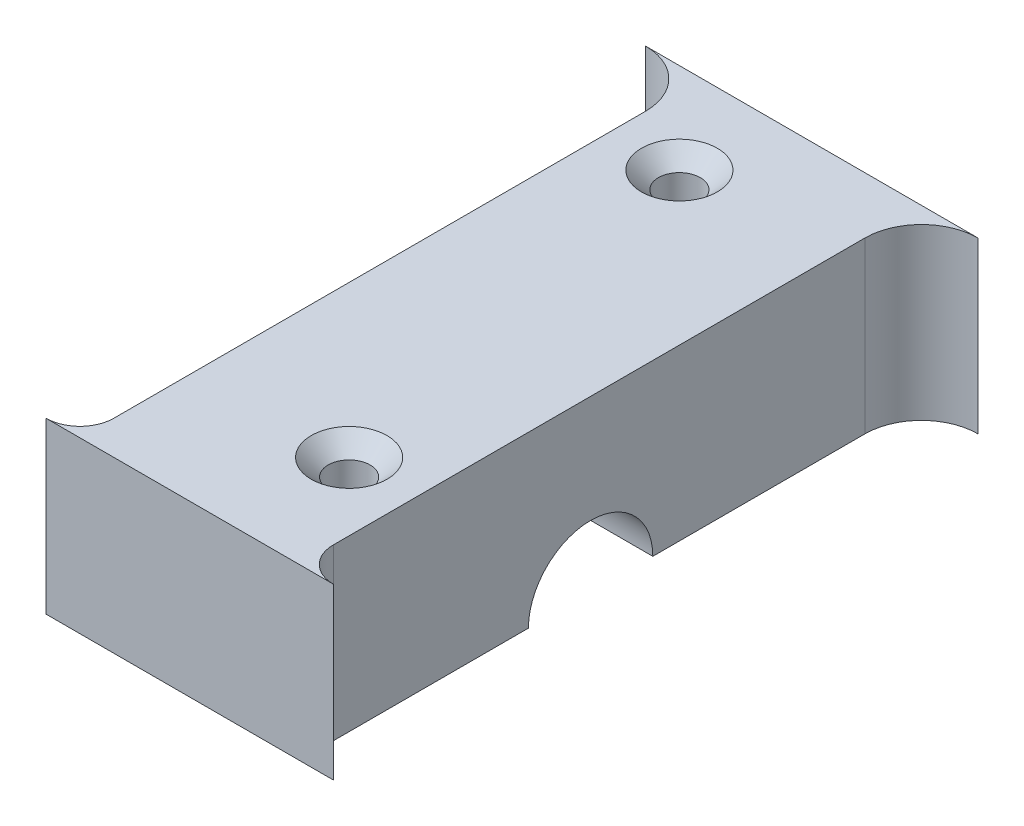
ISO-10303-21;
HEADER;
FILE_DESCRIPTION(('STEP AP214'),'2;1');
FILE_NAME('part.step','',(''),(''),'','','');
FILE_SCHEMA(('AUTOMOTIVE_DESIGN { 1 0 10303 214 1 1 1 1 }'));
ENDSEC;
DATA;
#1=APPLICATION_CONTEXT('core data for automotive mechanical design processes');
#2=APPLICATION_PROTOCOL_DEFINITION('international standard','automotive_design',2000,#1);
#3=PRODUCT_CONTEXT('',#1,'mechanical');
#4=PRODUCT('Part','Part','',(#3));
#5=PRODUCT_RELATED_PRODUCT_CATEGORY('part','',(#4));
#6=PRODUCT_DEFINITION_FORMATION('','',#4);
#7=PRODUCT_DEFINITION_CONTEXT('part definition',#1,'design');
#8=PRODUCT_DEFINITION('design','',#6,#7);
#9=PRODUCT_DEFINITION_SHAPE('','',#8);
#10=(LENGTH_UNIT() NAMED_UNIT(*) SI_UNIT(.MILLI.,.METRE.));
#11=(NAMED_UNIT(*) PLANE_ANGLE_UNIT() SI_UNIT($,.RADIAN.));
#12=(NAMED_UNIT(*) SI_UNIT($,.STERADIAN.) SOLID_ANGLE_UNIT());
#13=UNCERTAINTY_MEASURE_WITH_UNIT(LENGTH_MEASURE(1.E-05),#10,'distance_accuracy_value','');
#14=(GEOMETRIC_REPRESENTATION_CONTEXT(3) GLOBAL_UNCERTAINTY_ASSIGNED_CONTEXT((#13)) GLOBAL_UNIT_ASSIGNED_CONTEXT((#10,
#11,#12)) REPRESENTATION_CONTEXT('',''));
#15=CARTESIAN_POINT('',(0.,0.,0.));
#16=DIRECTION('',(0.,0.,1.));
#17=DIRECTION('',(1.,0.,0.));
#18=AXIS2_PLACEMENT_3D('',#15,#16,#17);
#19=CARTESIAN_POINT('',(-2.00000000000001,0.,-25.75));
#20=DIRECTION('',(1.,0.,0.));
#21=DIRECTION('',(0.,0.,-1.));
#22=AXIS2_PLACEMENT_3D('',#19,#20,#21);
#23=CYLINDRICAL_SURFACE('',#22,5.5);
#24=CARTESIAN_POINT('',(10.7,0.,-25.75));
#25=DIRECTION('',(1.,0.,0.));
#26=DIRECTION('',(0.,0.,-1.));
#27=AXIS2_PLACEMENT_3D('',#24,#25,#26);
#28=CIRCLE('',#27,5.5);
#29=CARTESIAN_POINT('',(10.7,0.,-20.25));
#30=VERTEX_POINT('',#29);
#31=CARTESIAN_POINT('',(10.7,0.,-31.25));
#32=VERTEX_POINT('',#31);
#33=EDGE_CURVE('E145',#30,#32,#28,.F.);
#34=ORIENTED_EDGE('',*,*,#33,.F.);
#35=DIRECTION('',(1.,0.,0.));
#36=VECTOR('',#35,1.);
#37=CARTESIAN_POINT('',(-2.00000000000001,0.,-20.25));
#38=LINE('',#37,#36);
#39=CARTESIAN_POINT('',(3.,0.,-20.25));
#40=VERTEX_POINT('',#39);
#41=EDGE_CURVE('E234',#40,#30,#38,.T.);
#42=ORIENTED_EDGE('',*,*,#41,.F.);
#43=CARTESIAN_POINT('',(3.,0.,-25.75));
#44=DIRECTION('',(1.,0.,0.));
#45=DIRECTION('',(0.,0.,-1.));
#46=AXIS2_PLACEMENT_3D('',#43,#44,#45);
#47=CIRCLE('',#46,5.5);
#48=CARTESIAN_POINT('',(3.,0.,-31.25));
#49=VERTEX_POINT('',#48);
#50=EDGE_CURVE('E256',#49,#40,#47,.T.);
#51=ORIENTED_EDGE('',*,*,#50,.F.);
#52=DIRECTION('',(1.,0.,0.));
#53=VECTOR('',#52,1.);
#54=CARTESIAN_POINT('',(-2.00000000000001,0.,-31.25));
#55=LINE('',#54,#53);
#56=EDGE_CURVE('E63',#32,#49,#55,.F.);
#57=ORIENTED_EDGE('',*,*,#56,.F.);
#58=EDGE_LOOP('',(#34,#42,#51,#57));
#59=FACE_BOUND('',#58,.T.);
#60=ADVANCED_FACE('F39',(#59),#23,.F.);
#61=CARTESIAN_POINT('',(0.,0.,-3.));
#62=DIRECTION('',(0.,1.,0.));
#63=DIRECTION('',(0.,0.,1.));
#64=AXIS2_PLACEMENT_3D('',#61,#62,#63);
#65=PLANE('',#64);
#66=CARTESIAN_POINT('',(16.4,0.,-10.4));
#67=DIRECTION('',(0.,-1.,0.));
#68=DIRECTION('',(0.,0.,-1.));
#69=AXIS2_PLACEMENT_3D('',#66,#67,#68);
#70=CIRCLE('',#69,1.85);
#71=CARTESIAN_POINT('',(16.4,0.,-12.25));
#72=VERTEX_POINT('',#71);
#73=EDGE_CURVE('E158',#72,#72,#70,.T.);
#74=ORIENTED_EDGE('',*,*,#73,.F.);
#75=EDGE_LOOP('',(#74));
#76=FACE_BOUND('',#75,.T.);
#77=DIRECTION('',(-1.,0.,0.));
#78=VECTOR('',#77,1.);
#79=CARTESIAN_POINT('',(14.7,0.,-14.25));
#80=LINE('',#79,#78);
#81=CARTESIAN_POINT('',(14.7,0.,-14.25));
#82=VERTEX_POINT('',#81);
#83=CARTESIAN_POINT('',(10.7,0.,-14.25));
#84=VERTEX_POINT('',#83);
#85=EDGE_CURVE('E156',#82,#84,#80,.T.);
#86=ORIENTED_EDGE('',*,*,#85,.F.);
#87=DIRECTION('',(0.,0.,-1.));
#88=VECTOR('',#87,1.);
#89=CARTESIAN_POINT('',(14.7,0.,-3.));
#90=LINE('',#89,#88);
#91=CARTESIAN_POINT('',(14.7,0.,-20.25));
#92=VERTEX_POINT('',#91);
#93=EDGE_CURVE('E248',#82,#92,#90,.T.);
#94=ORIENTED_EDGE('',*,*,#93,.T.);
#95=CARTESIAN_POINT('',(22.4,0.,-20.25));
#96=VERTEX_POINT('',#95);
#97=EDGE_CURVE('E233',#92,#96,#38,.T.);
#98=ORIENTED_EDGE('',*,*,#97,.T.);
#99=DIRECTION('',(0.,0.,-1.));
#100=VECTOR('',#99,1.);
#101=CARTESIAN_POINT('',(22.4,0.,-50.));
#102=LINE('',#101,#100);
#103=CARTESIAN_POINT('',(22.4,0.,-3.));
#104=VERTEX_POINT('',#103);
#105=EDGE_CURVE('E247',#104,#96,#102,.T.);
#106=ORIENTED_EDGE('',*,*,#105,.F.);
#107=CARTESIAN_POINT('',(25.4,0.,-3.));
#108=DIRECTION('',(0.,-1.,0.));
#109=DIRECTION('',(0.,0.,-1.));
#110=AXIS2_PLACEMENT_3D('',#107,#108,#109);
#111=CIRCLE('',#110,3.);
#112=CARTESIAN_POINT('',(25.4,0.,0.));
#113=VERTEX_POINT('',#112);
#114=EDGE_CURVE('E270',#113,#104,#111,.T.);
#115=ORIENTED_EDGE('',*,*,#114,.F.);
#116=DIRECTION('',(1.,0.,0.));
#117=VECTOR('',#116,1.);
#118=CARTESIAN_POINT('',(0.,0.,0.));
#119=LINE('',#118,#117);
#120=CARTESIAN_POINT('',(0.,0.,0.));
#121=VERTEX_POINT('',#120);
#122=EDGE_CURVE('E325',#121,#113,#119,.T.);
#123=ORIENTED_EDGE('',*,*,#122,.F.);
#124=CARTESIAN_POINT('',(0.,0.,-3.));
#125=DIRECTION('',(0.,-1.,0.));
#126=DIRECTION('',(0.,0.,1.));
#127=AXIS2_PLACEMENT_3D('',#124,#125,#126);
#128=CIRCLE('',#127,3.);
#129=CARTESIAN_POINT('',(3.,0.,-3.));
#130=VERTEX_POINT('',#129);
#131=EDGE_CURVE('E218',#130,#121,#128,.T.);
#132=ORIENTED_EDGE('',*,*,#131,.F.);
#133=DIRECTION('',(0.,0.,1.));
#134=VECTOR('',#133,1.);
#135=CARTESIAN_POINT('',(2.99999999999999,0.,-50.));
#136=LINE('',#135,#134);
#137=EDGE_CURVE('E279',#40,#130,#136,.T.);
#138=ORIENTED_EDGE('',*,*,#137,.F.);
#139=ORIENTED_EDGE('',*,*,#41,.T.);
#140=DIRECTION('',(0.,0.,-1.));
#141=VECTOR('',#140,1.);
#142=CARTESIAN_POINT('',(10.7,0.,-3.));
#143=LINE('',#142,#141);
#144=EDGE_CURVE('E55',#84,#30,#143,.T.);
#145=ORIENTED_EDGE('',*,*,#144,.F.);
#146=EDGE_LOOP('',(#86,#94,#98,#106,#115,#123,#132,#138,#139,#145));
#147=FACE_BOUND('',#146,.T.);
#148=ADVANCED_FACE('F244',(#76,#147),#65,.F.);
#149=CARTESIAN_POINT('',(0.,15.,-3.));
#150=DIRECTION('',(0.,-1.,0.));
#151=DIRECTION('',(0.,0.,-1.));
#152=AXIS2_PLACEMENT_3D('',#149,#150,#151);
#153=CYLINDRICAL_SURFACE('',#152,3.);
#154=ORIENTED_EDGE('',*,*,#131,.T.);
#155=DIRECTION('',(0.,-1.,0.));
#156=VECTOR('',#155,1.);
#157=CARTESIAN_POINT('',(0.,15.,0.));
#158=LINE('',#157,#156);
#159=CARTESIAN_POINT('',(0.,15.,0.));
#160=VERTEX_POINT('',#159);
#161=EDGE_CURVE('E215',#160,#121,#158,.T.);
#162=ORIENTED_EDGE('',*,*,#161,.F.);
#163=CARTESIAN_POINT('',(0.,15.,-3.));
#164=DIRECTION('',(0.,-1.,0.));
#165=DIRECTION('',(0.,0.,1.));
#166=AXIS2_PLACEMENT_3D('',#163,#164,#165);
#167=CIRCLE('',#166,3.);
#168=CARTESIAN_POINT('',(3.,15.,-3.));
#169=VERTEX_POINT('',#168);
#170=EDGE_CURVE('E201',#169,#160,#167,.T.);
#171=ORIENTED_EDGE('',*,*,#170,.F.);
#172=DIRECTION('',(0.,-1.,0.));
#173=VECTOR('',#172,1.);
#174=CARTESIAN_POINT('',(3.,15.,-3.));
#175=LINE('',#174,#173);
#176=EDGE_CURVE('E283',#169,#130,#175,.T.);
#177=ORIENTED_EDGE('',*,*,#176,.T.);
#178=EDGE_LOOP('',(#154,#162,#171,#177));
#179=FACE_BOUND('',#178,.T.);
#180=ADVANCED_FACE('F216',(#179),#153,.F.);
#181=CARTESIAN_POINT('',(0.,15.,0.));
#182=DIRECTION('',(0.,0.,-1.));
#183=DIRECTION('',(-1.,0.,0.));
#184=AXIS2_PLACEMENT_3D('',#181,#182,#183);
#185=PLANE('',#184);
#186=ORIENTED_EDGE('',*,*,#122,.T.);
#187=DIRECTION('',(0.,-1.,0.));
#188=VECTOR('',#187,1.);
#189=CARTESIAN_POINT('',(25.4,15.,0.));
#190=LINE('',#189,#188);
#191=CARTESIAN_POINT('',(25.4,15.,0.));
#192=VERTEX_POINT('',#191);
#193=EDGE_CURVE('E221',#192,#113,#190,.T.);
#194=ORIENTED_EDGE('',*,*,#193,.F.);
#195=DIRECTION('',(1.,0.,0.));
#196=VECTOR('',#195,1.);
#197=CARTESIAN_POINT('',(0.,15.,0.));
#198=LINE('',#197,#196);
#199=EDGE_CURVE('E203',#160,#192,#198,.T.);
#200=ORIENTED_EDGE('',*,*,#199,.F.);
#201=ORIENTED_EDGE('',*,*,#161,.T.);
#202=EDGE_LOOP('',(#186,#194,#200,#201));
#203=FACE_BOUND('',#202,.T.);
#204=ADVANCED_FACE('F357',(#203),#185,.F.);
#205=CARTESIAN_POINT('',(25.4,15.,-3.));
#206=DIRECTION('',(0.,-1.,0.));
#207=DIRECTION('',(0.,0.,-1.));
#208=AXIS2_PLACEMENT_3D('',#205,#206,#207);
#209=CYLINDRICAL_SURFACE('',#208,3.);
#210=ORIENTED_EDGE('',*,*,#114,.T.);
#211=DIRECTION('',(0.,-1.,0.));
#212=VECTOR('',#211,1.);
#213=CARTESIAN_POINT('',(22.4,15.,-3.));
#214=LINE('',#213,#212);
#215=CARTESIAN_POINT('',(22.4,15.,-3.));
#216=VERTEX_POINT('',#215);
#217=EDGE_CURVE('E228',#216,#104,#214,.T.);
#218=ORIENTED_EDGE('',*,*,#217,.F.);
#219=CARTESIAN_POINT('',(25.4,15.,-3.));
#220=DIRECTION('',(0.,-1.,0.));
#221=DIRECTION('',(0.,0.,-1.));
#222=AXIS2_PLACEMENT_3D('',#219,#220,#221);
#223=CIRCLE('',#222,3.);
#224=EDGE_CURVE('E316',#192,#216,#223,.T.);
#225=ORIENTED_EDGE('',*,*,#224,.F.);
#226=ORIENTED_EDGE('',*,*,#193,.T.);
#227=EDGE_LOOP('',(#210,#218,#225,#226));
#228=FACE_BOUND('',#227,.T.);
#229=ADVANCED_FACE('F475',(#228),#209,.F.);
#230=CARTESIAN_POINT('',(22.4,15.,-50.));
#231=DIRECTION('',(-1.,0.,0.));
#232=DIRECTION('',(0.,0.,1.));
#233=AXIS2_PLACEMENT_3D('',#230,#231,#232);
#234=PLANE('',#233);
#235=ORIENTED_EDGE('',*,*,#105,.T.);
#236=CARTESIAN_POINT('',(22.4,0.,-25.75));
#237=DIRECTION('',(-1.,0.,0.));
#238=DIRECTION('',(0.,0.,1.));
#239=AXIS2_PLACEMENT_3D('',#236,#237,#238);
#240=CIRCLE('',#239,5.5);
#241=CARTESIAN_POINT('',(22.4,0.,-31.25));
#242=VERTEX_POINT('',#241);
#243=EDGE_CURVE('E251',#96,#242,#240,.T.);
#244=ORIENTED_EDGE('',*,*,#243,.T.);
#245=CARTESIAN_POINT('',(22.4,0.,-50.));
#246=VERTEX_POINT('',#245);
#247=EDGE_CURVE('E264',#242,#246,#102,.T.);
#248=ORIENTED_EDGE('',*,*,#247,.T.);
#249=DIRECTION('',(0.,-1.,0.));
#250=VECTOR('',#249,1.);
#251=CARTESIAN_POINT('',(22.4,15.,-50.));
#252=LINE('',#251,#250);
#253=CARTESIAN_POINT('',(22.4,15.,-50.));
#254=VERTEX_POINT('',#253);
#255=EDGE_CURVE('E298',#254,#246,#252,.T.);
#256=ORIENTED_EDGE('',*,*,#255,.F.);
#257=DIRECTION('',(0.,0.,-1.));
#258=VECTOR('',#257,1.);
#259=CARTESIAN_POINT('',(22.4,15.,-50.));
#260=LINE('',#259,#258);
#261=EDGE_CURVE('E313',#216,#254,#260,.T.);
#262=ORIENTED_EDGE('',*,*,#261,.F.);
#263=ORIENTED_EDGE('',*,*,#217,.T.);
#264=EDGE_LOOP('',(#235,#244,#248,#256,#262,#263));
#265=FACE_BOUND('',#264,.T.);
#266=ADVANCED_FACE('F259',(#265),#234,.F.);
#267=CARTESIAN_POINT('',(27.4,15.,-50.));
#268=DIRECTION('',(0.,-1.,0.));
#269=DIRECTION('',(0.,0.,-1.));
#270=AXIS2_PLACEMENT_3D('',#267,#268,#269);
#271=CYLINDRICAL_SURFACE('',#270,5.);
#272=CARTESIAN_POINT('',(27.4,0.,-50.));
#273=DIRECTION('',(0.,-1.,0.));
#274=DIRECTION('',(0.,0.,1.));
#275=AXIS2_PLACEMENT_3D('',#272,#273,#274);
#276=CIRCLE('',#275,5.);
#277=CARTESIAN_POINT('',(27.4,0.,-55.));
#278=VERTEX_POINT('',#277);
#279=EDGE_CURVE('E263',#246,#278,#276,.T.);
#280=ORIENTED_EDGE('',*,*,#279,.T.);
#281=DIRECTION('',(0.,-1.,0.));
#282=VECTOR('',#281,1.);
#283=CARTESIAN_POINT('',(27.4,15.,-55.));
#284=LINE('',#283,#282);
#285=CARTESIAN_POINT('',(27.4,15.,-55.));
#286=VERTEX_POINT('',#285);
#287=EDGE_CURVE('E294',#286,#278,#284,.T.);
#288=ORIENTED_EDGE('',*,*,#287,.F.);
#289=CARTESIAN_POINT('',(27.4,15.,-50.));
#290=DIRECTION('',(0.,-1.,0.));
#291=DIRECTION('',(0.,0.,1.));
#292=AXIS2_PLACEMENT_3D('',#289,#290,#291);
#293=CIRCLE('',#292,5.);
#294=EDGE_CURVE('E310',#254,#286,#293,.T.);
#295=ORIENTED_EDGE('',*,*,#294,.F.);
#296=ORIENTED_EDGE('',*,*,#255,.T.);
#297=EDGE_LOOP('',(#280,#288,#295,#296));
#298=FACE_BOUND('',#297,.T.);
#299=ADVANCED_FACE('F460',(#298),#271,.F.);
#300=CARTESIAN_POINT('',(27.4,15.,-55.));
#301=DIRECTION('',(0.,0.,1.));
#302=DIRECTION('',(1.,0.,0.));
#303=AXIS2_PLACEMENT_3D('',#300,#301,#302);
#304=PLANE('',#303);
#305=DIRECTION('',(-1.,0.,0.));
#306=VECTOR('',#305,1.);
#307=CARTESIAN_POINT('',(27.4,0.,-55.));
#308=LINE('',#307,#306);
#309=CARTESIAN_POINT('',(-2.00000000000001,0.,-55.));
#310=VERTEX_POINT('',#309);
#311=EDGE_CURVE('E268',#278,#310,#308,.T.);
#312=ORIENTED_EDGE('',*,*,#311,.T.);
#313=DIRECTION('',(0.,-1.,0.));
#314=VECTOR('',#313,1.);
#315=CARTESIAN_POINT('',(-2.00000000000001,15.,-55.));
#316=LINE('',#315,#314);
#317=CARTESIAN_POINT('',(-2.00000000000001,15.,-55.));
#318=VERTEX_POINT('',#317);
#319=EDGE_CURVE('E290',#318,#310,#316,.T.);
#320=ORIENTED_EDGE('',*,*,#319,.F.);
#321=DIRECTION('',(-1.,0.,0.));
#322=VECTOR('',#321,1.);
#323=CARTESIAN_POINT('',(27.4,15.,-55.));
#324=LINE('',#323,#322);
#325=EDGE_CURVE('E307',#286,#318,#324,.T.);
#326=ORIENTED_EDGE('',*,*,#325,.F.);
#327=ORIENTED_EDGE('',*,*,#287,.T.);
#328=EDGE_LOOP('',(#312,#320,#326,#327));
#329=FACE_BOUND('',#328,.T.);
#330=ADVANCED_FACE('F452',(#329),#304,.F.);
#331=CARTESIAN_POINT('',(-2.,15.,-50.));
#332=DIRECTION('',(0.,-1.,0.));
#333=DIRECTION('',(0.,0.,-1.));
#334=AXIS2_PLACEMENT_3D('',#331,#332,#333);
#335=CYLINDRICAL_SURFACE('',#334,5.);
#336=CARTESIAN_POINT('',(-2.,0.,-50.));
#337=DIRECTION('',(0.,-1.,0.));
#338=DIRECTION('',(0.,0.,-1.));
#339=AXIS2_PLACEMENT_3D('',#336,#337,#338);
#340=CIRCLE('',#339,5.);
#341=CARTESIAN_POINT('',(2.99999999999999,0.,-50.));
#342=VERTEX_POINT('',#341);
#343=EDGE_CURVE('E276',#310,#342,#340,.T.);
#344=ORIENTED_EDGE('',*,*,#343,.T.);
#345=DIRECTION('',(0.,-1.,0.));
#346=VECTOR('',#345,1.);
#347=CARTESIAN_POINT('',(2.99999999999999,15.,-50.));
#348=LINE('',#347,#346);
#349=CARTESIAN_POINT('',(2.99999999999999,15.,-50.));
#350=VERTEX_POINT('',#349);
#351=EDGE_CURVE('E286',#350,#342,#348,.T.);
#352=ORIENTED_EDGE('',*,*,#351,.F.);
#353=CARTESIAN_POINT('',(-2.,15.,-50.));
#354=DIRECTION('',(0.,-1.,0.));
#355=DIRECTION('',(0.,0.,-1.));
#356=AXIS2_PLACEMENT_3D('',#353,#354,#355);
#357=CIRCLE('',#356,5.);
#358=EDGE_CURVE('E304',#318,#350,#357,.T.);
#359=ORIENTED_EDGE('',*,*,#358,.F.);
#360=ORIENTED_EDGE('',*,*,#319,.T.);
#361=EDGE_LOOP('',(#344,#352,#359,#360));
#362=FACE_BOUND('',#361,.T.);
#363=ADVANCED_FACE('F445',(#362),#335,.F.);
#364=CARTESIAN_POINT('',(2.99999999999999,15.,-50.));
#365=DIRECTION('',(1.,0.,0.));
#366=DIRECTION('',(0.,0.,-1.));
#367=AXIS2_PLACEMENT_3D('',#364,#365,#366);
#368=PLANE('',#367);
#369=EDGE_CURVE('E211',#342,#49,#136,.T.);
#370=ORIENTED_EDGE('',*,*,#369,.T.);
#371=ORIENTED_EDGE('',*,*,#50,.T.);
#372=ORIENTED_EDGE('',*,*,#137,.T.);
#373=ORIENTED_EDGE('',*,*,#176,.F.);
#374=DIRECTION('',(0.,0.,1.));
#375=VECTOR('',#374,1.);
#376=CARTESIAN_POINT('',(2.99999999999999,15.,-50.));
#377=LINE('',#376,#375);
#378=EDGE_CURVE('E206',#350,#169,#377,.T.);
#379=ORIENTED_EDGE('',*,*,#378,.F.);
#380=ORIENTED_EDGE('',*,*,#351,.T.);
#381=EDGE_LOOP('',(#370,#371,#372,#373,#379,#380));
#382=FACE_BOUND('',#381,.T.);
#383=ADVANCED_FACE('F195',(#382),#368,.F.);
#384=CARTESIAN_POINT('',(0.,15.,-3.));
#385=DIRECTION('',(0.,1.,0.));
#386=DIRECTION('',(0.,0.,1.));
#387=AXIS2_PLACEMENT_3D('',#384,#385,#386);
#388=PLANE('',#387);
#389=CARTESIAN_POINT('',(8.99999999999999,15.,-47.));
#390=DIRECTION('',(0.,1.,0.));
#391=DIRECTION('',(0.,0.,1.));
#392=AXIS2_PLACEMENT_3D('',#389,#390,#391);
#393=CIRCLE('',#392,3.34999999999999);
#394=CARTESIAN_POINT('',(8.99999999999999,15.,-43.65));
#395=VERTEX_POINT('',#394);
#396=EDGE_CURVE('E171',#395,#395,#393,.F.);
#397=ORIENTED_EDGE('',*,*,#396,.T.);
#398=EDGE_LOOP('',(#397));
#399=FACE_BOUND('',#398,.T.);
#400=CARTESIAN_POINT('',(16.4,15.,-10.4));
#401=DIRECTION('',(0.,1.,0.));
#402=DIRECTION('',(0.,0.,1.));
#403=AXIS2_PLACEMENT_3D('',#400,#401,#402);
#404=CIRCLE('',#403,3.35);
#405=CARTESIAN_POINT('',(16.4,15.,-7.05));
#406=VERTEX_POINT('',#405);
#407=EDGE_CURVE('E165',#406,#406,#404,.F.);
#408=ORIENTED_EDGE('',*,*,#407,.T.);
#409=EDGE_LOOP('',(#408));
#410=FACE_BOUND('',#409,.T.);
#411=ORIENTED_EDGE('',*,*,#170,.T.);
#412=ORIENTED_EDGE('',*,*,#199,.T.);
#413=ORIENTED_EDGE('',*,*,#224,.T.);
#414=ORIENTED_EDGE('',*,*,#261,.T.);
#415=ORIENTED_EDGE('',*,*,#294,.T.);
#416=ORIENTED_EDGE('',*,*,#325,.T.);
#417=ORIENTED_EDGE('',*,*,#358,.T.);
#418=ORIENTED_EDGE('',*,*,#378,.T.);
#419=EDGE_LOOP('',(#411,#412,#413,#414,#415,#416,#417,#418));
#420=FACE_BOUND('',#419,.T.);
#421=ADVANCED_FACE('F192',(#399,#410,#420),#388,.T.);
#422=CARTESIAN_POINT('',(8.99999999999999,0.,-47.));
#423=DIRECTION('',(0.,-1.,0.));
#424=DIRECTION('',(0.,0.,-1.));
#425=AXIS2_PLACEMENT_3D('',#422,#423,#424);
#426=CIRCLE('',#425,1.85);
#427=CARTESIAN_POINT('',(8.99999999999999,0.,-48.85));
#428=VERTEX_POINT('',#427);
#429=EDGE_CURVE('E342',#428,#428,#426,.T.);
#430=ORIENTED_EDGE('',*,*,#429,.F.);
#431=EDGE_LOOP('',(#430));
#432=FACE_BOUND('',#431,.T.);
#433=CARTESIAN_POINT('',(14.7,0.,-31.25));
#434=VERTEX_POINT('',#433);
#435=EDGE_CURVE('E225',#242,#434,#55,.F.);
#436=ORIENTED_EDGE('',*,*,#435,.T.);
#437=DIRECTION('',(0.,0.,-1.));
#438=VECTOR('',#437,1.);
#439=CARTESIAN_POINT('',(14.7,0.,-3.));
#440=LINE('',#439,#438);
#441=CARTESIAN_POINT('',(14.7,0.,-37.25));
#442=VERTEX_POINT('',#441);
#443=EDGE_CURVE('E163',#434,#442,#440,.T.);
#444=ORIENTED_EDGE('',*,*,#443,.T.);
#445=DIRECTION('',(-1.,0.,0.));
#446=VECTOR('',#445,1.);
#447=CARTESIAN_POINT('',(14.7,0.,-37.25));
#448=LINE('',#447,#446);
#449=CARTESIAN_POINT('',(10.7,0.,-37.25));
#450=VERTEX_POINT('',#449);
#451=EDGE_CURVE('E153',#450,#442,#448,.F.);
#452=ORIENTED_EDGE('',*,*,#451,.F.);
#453=DIRECTION('',(0.,0.,-1.));
#454=VECTOR('',#453,1.);
#455=CARTESIAN_POINT('',(10.7,0.,-3.));
#456=LINE('',#455,#454);
#457=EDGE_CURVE('E141',#32,#450,#456,.T.);
#458=ORIENTED_EDGE('',*,*,#457,.F.);
#459=ORIENTED_EDGE('',*,*,#56,.T.);
#460=ORIENTED_EDGE('',*,*,#369,.F.);
#461=ORIENTED_EDGE('',*,*,#343,.F.);
#462=ORIENTED_EDGE('',*,*,#311,.F.);
#463=ORIENTED_EDGE('',*,*,#279,.F.);
#464=ORIENTED_EDGE('',*,*,#247,.F.);
#465=EDGE_LOOP('',(#436,#444,#452,#458,#459,#460,#461,#462,#463,#464));
#466=FACE_BOUND('',#465,.T.);
#467=ADVANCED_FACE('F162',(#432,#466),#65,.F.);
#468=ORIENTED_EDGE('',*,*,#97,.F.);
#469=CARTESIAN_POINT('',(14.7,0.,-25.75));
#470=DIRECTION('',(1.,0.,0.));
#471=DIRECTION('',(0.,0.,-1.));
#472=AXIS2_PLACEMENT_3D('',#469,#470,#471);
#473=CIRCLE('',#472,5.5);
#474=EDGE_CURVE('E166',#92,#434,#473,.F.);
#475=ORIENTED_EDGE('',*,*,#474,.T.);
#476=ORIENTED_EDGE('',*,*,#435,.F.);
#477=ORIENTED_EDGE('',*,*,#243,.F.);
#478=EDGE_LOOP('',(#468,#475,#476,#477));
#479=FACE_BOUND('',#478,.T.);
#480=ADVANCED_FACE('F252',(#479),#23,.F.);
#481=CARTESIAN_POINT('',(14.7,0.,-25.75));
#482=DIRECTION('',(-1.,0.,0.));
#483=DIRECTION('',(0.,0.,1.));
#484=AXIS2_PLACEMENT_3D('',#481,#482,#483);
#485=CYLINDRICAL_SURFACE('',#484,11.5);
#486=ORIENTED_EDGE('',*,*,#85,.T.);
#487=CARTESIAN_POINT('',(10.7,0.,-25.75));
#488=DIRECTION('',(1.,0.,0.));
#489=DIRECTION('',(0.,0.,-1.));
#490=AXIS2_PLACEMENT_3D('',#487,#488,#489);
#491=CIRCLE('',#490,11.5);
#492=EDGE_CURVE('E144',#450,#84,#491,.T.);
#493=ORIENTED_EDGE('',*,*,#492,.F.);
#494=ORIENTED_EDGE('',*,*,#451,.T.);
#495=CARTESIAN_POINT('',(14.7,0.,-25.75));
#496=DIRECTION('',(1.,0.,0.));
#497=DIRECTION('',(0.,0.,-1.));
#498=AXIS2_PLACEMENT_3D('',#495,#496,#497);
#499=CIRCLE('',#498,11.5);
#500=EDGE_CURVE('E148',#442,#82,#499,.T.);
#501=ORIENTED_EDGE('',*,*,#500,.T.);
#502=EDGE_LOOP('',(#486,#493,#494,#501));
#503=FACE_BOUND('',#502,.T.);
#504=ADVANCED_FACE('F151',(#503),#485,.F.);
#505=CARTESIAN_POINT('',(14.7,0.,-25.75));
#506=DIRECTION('',(1.,0.,0.));
#507=DIRECTION('',(0.,0.,-1.));
#508=AXIS2_PLACEMENT_3D('',#505,#506,#507);
#509=PLANE('',#508);
#510=ORIENTED_EDGE('',*,*,#500,.F.);
#511=ORIENTED_EDGE('',*,*,#443,.F.);
#512=ORIENTED_EDGE('',*,*,#474,.F.);
#513=ORIENTED_EDGE('',*,*,#93,.F.);
#514=EDGE_LOOP('',(#510,#511,#512,#513));
#515=FACE_BOUND('',#514,.T.);
#516=ADVANCED_FACE('F376',(#515),#509,.F.);
#517=CARTESIAN_POINT('',(10.7,0.,-25.75));
#518=DIRECTION('',(1.,0.,0.));
#519=DIRECTION('',(0.,0.,-1.));
#520=AXIS2_PLACEMENT_3D('',#517,#518,#519);
#521=PLANE('',#520);
#522=ORIENTED_EDGE('',*,*,#144,.T.);
#523=ORIENTED_EDGE('',*,*,#33,.T.);
#524=ORIENTED_EDGE('',*,*,#457,.T.);
#525=ORIENTED_EDGE('',*,*,#492,.T.);
#526=EDGE_LOOP('',(#522,#523,#524,#525));
#527=FACE_BOUND('',#526,.T.);
#528=ADVANCED_FACE('F143',(#527),#521,.T.);
#529=CARTESIAN_POINT('',(8.99999999999999,15.,-47.));
#530=DIRECTION('',(0.,-1.,0.));
#531=DIRECTION('',(0.,0.,-1.));
#532=AXIS2_PLACEMENT_3D('',#529,#530,#531);
#533=CYLINDRICAL_SURFACE('',#532,1.85);
#534=CARTESIAN_POINT('',(8.99999999999999,13.5,-47.));
#535=DIRECTION('',(0.,1.,0.));
#536=DIRECTION('',(0.,0.,1.));
#537=AXIS2_PLACEMENT_3D('',#534,#535,#536);
#538=CIRCLE('',#537,1.85);
#539=CARTESIAN_POINT('',(8.99999999999999,13.5,-45.15));
#540=VERTEX_POINT('',#539);
#541=EDGE_CURVE('E48',#540,#540,#538,.T.);
#542=ORIENTED_EDGE('',*,*,#541,.T.);
#543=EDGE_LOOP('',(#542));
#544=FACE_BOUND('',#543,.T.);
#545=ORIENTED_EDGE('',*,*,#429,.T.);
#546=EDGE_LOOP('',(#545));
#547=FACE_BOUND('',#546,.T.);
#548=ADVANCED_FACE('F183',(#544,#547),#533,.F.);
#549=CARTESIAN_POINT('',(16.4,15.,-10.4));
#550=DIRECTION('',(0.,-1.,0.));
#551=DIRECTION('',(0.,0.,-1.));
#552=AXIS2_PLACEMENT_3D('',#549,#550,#551);
#553=CYLINDRICAL_SURFACE('',#552,1.85);
#554=CARTESIAN_POINT('',(16.4,13.5,-10.4));
#555=DIRECTION('',(0.,1.,0.));
#556=DIRECTION('',(0.,0.,1.));
#557=AXIS2_PLACEMENT_3D('',#554,#555,#556);
#558=CIRCLE('',#557,1.85);
#559=CARTESIAN_POINT('',(16.4,13.5,-8.55));
#560=VERTEX_POINT('',#559);
#561=EDGE_CURVE('E11',#560,#560,#558,.T.);
#562=ORIENTED_EDGE('',*,*,#561,.T.);
#563=EDGE_LOOP('',(#562));
#564=FACE_BOUND('',#563,.T.);
#565=ORIENTED_EDGE('',*,*,#73,.T.);
#566=EDGE_LOOP('',(#565));
#567=FACE_BOUND('',#566,.T.);
#568=ADVANCED_FACE('F189',(#564,#567),#553,.F.);
#569=CARTESIAN_POINT('',(8.99999999999999,15.,-47.));
#570=DIRECTION('',(0.,1.,0.));
#571=DIRECTION('',(0.,0.,1.));
#572=AXIS2_PLACEMENT_3D('',#569,#570,#571);
#573=CONICAL_SURFACE('',#572,3.34999999999999,0.785398163397447);
#574=ORIENTED_EDGE('',*,*,#541,.F.);
#575=EDGE_LOOP('',(#574));
#576=FACE_BOUND('',#575,.T.);
#577=ORIENTED_EDGE('',*,*,#396,.F.);
#578=EDGE_LOOP('',(#577));
#579=FACE_BOUND('',#578,.T.);
#580=ADVANCED_FACE('F186',(#576,#579),#573,.F.);
#581=CARTESIAN_POINT('',(16.4,15.,-10.4));
#582=DIRECTION('',(0.,1.,0.));
#583=DIRECTION('',(0.,0.,1.));
#584=AXIS2_PLACEMENT_3D('',#581,#582,#583);
#585=CONICAL_SURFACE('',#584,3.35,0.785398163397448);
#586=ORIENTED_EDGE('',*,*,#561,.F.);
#587=EDGE_LOOP('',(#586));
#588=FACE_BOUND('',#587,.T.);
#589=ORIENTED_EDGE('',*,*,#407,.F.);
#590=EDGE_LOOP('',(#589));
#591=FACE_BOUND('',#590,.T.);
#592=ADVANCED_FACE('F41',(#588,#591),#585,.F.);
#593=CLOSED_SHELL('',(#60,#148,#180,#204,#229,#266,#299,#330,#363,#383,#421,#467,#480,#504,#516,
#528,#548,#568,#580,#592));
#594=MANIFOLD_SOLID_BREP('B2',#593);
#595=ADVANCED_BREP_SHAPE_REPRESENTATION('',(#18,#594),#14);
#596=SHAPE_DEFINITION_REPRESENTATION(#9,#595);
ENDSEC;
END-ISO-10303-21;
